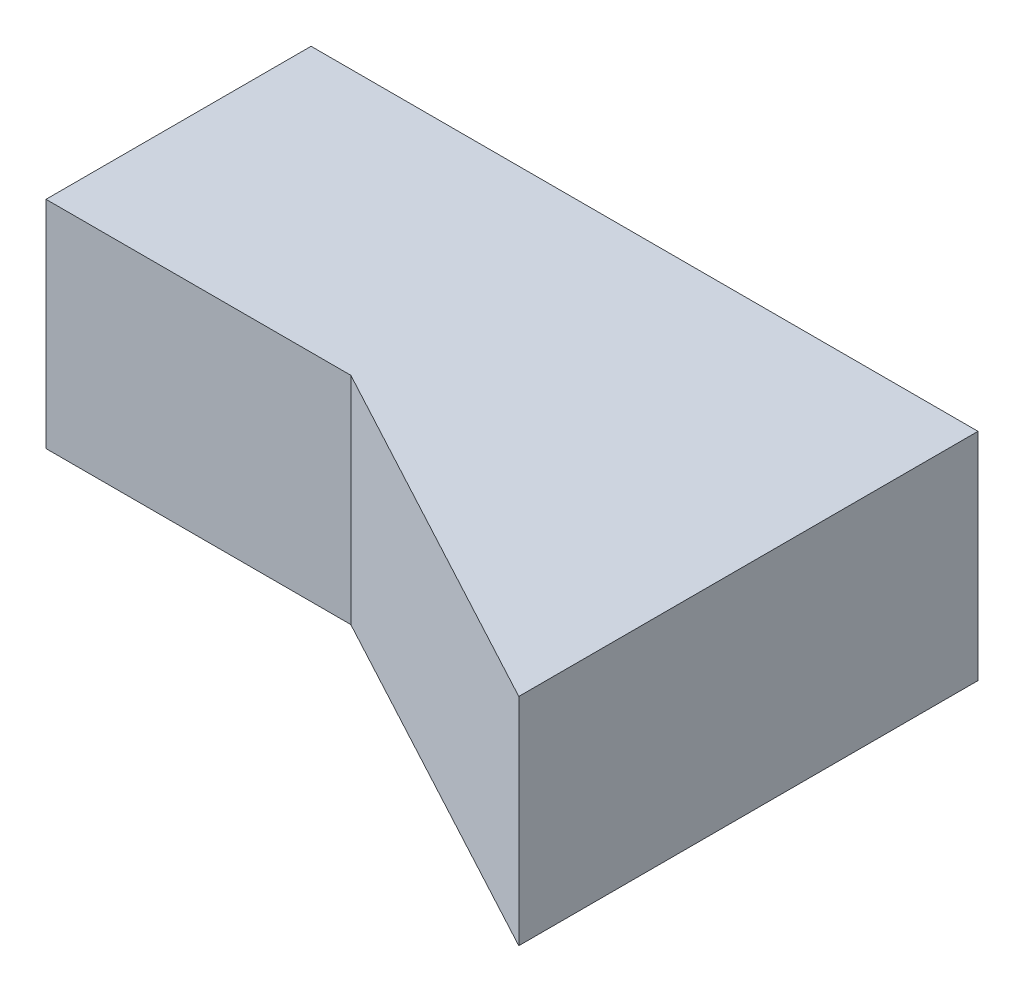
ISO-10303-21;
HEADER;
FILE_DESCRIPTION(('STEP AP214'),'2;1');
FILE_NAME('part.step','',(''),(''),'','','');
FILE_SCHEMA(('AUTOMOTIVE_DESIGN { 1 0 10303 214 1 1 1 1 }'));
ENDSEC;
DATA;
#1=APPLICATION_CONTEXT('core data for automotive mechanical design processes');
#2=APPLICATION_PROTOCOL_DEFINITION('international standard','automotive_design',2000,#1);
#3=PRODUCT_CONTEXT('',#1,'mechanical');
#4=PRODUCT('Part','Part','',(#3));
#5=PRODUCT_RELATED_PRODUCT_CATEGORY('part','',(#4));
#6=PRODUCT_DEFINITION_FORMATION('','',#4);
#7=PRODUCT_DEFINITION_CONTEXT('part definition',#1,'design');
#8=PRODUCT_DEFINITION('design','',#6,#7);
#9=PRODUCT_DEFINITION_SHAPE('','',#8);
#10=(LENGTH_UNIT() NAMED_UNIT(*) SI_UNIT(.MILLI.,.METRE.));
#11=(NAMED_UNIT(*) PLANE_ANGLE_UNIT() SI_UNIT($,.RADIAN.));
#12=(NAMED_UNIT(*) SI_UNIT($,.STERADIAN.) SOLID_ANGLE_UNIT());
#13=UNCERTAINTY_MEASURE_WITH_UNIT(LENGTH_MEASURE(1.E-05),#10,'distance_accuracy_value','');
#14=(GEOMETRIC_REPRESENTATION_CONTEXT(3) GLOBAL_UNCERTAINTY_ASSIGNED_CONTEXT((#13)) GLOBAL_UNIT_ASSIGNED_CONTEXT((#10,
#11,#12)) REPRESENTATION_CONTEXT('',''));
#15=CARTESIAN_POINT('',(0.,0.,0.));
#16=DIRECTION('',(0.,0.,1.));
#17=DIRECTION('',(1.,0.,0.));
#18=AXIS2_PLACEMENT_3D('',#15,#16,#17);
#19=CARTESIAN_POINT('',(0.,413.766,0.));
#20=DIRECTION('',(0.472550764869048,0.,-0.881303452064995));
#21=DIRECTION('',(-0.881303452064995,0.,-0.472550764869048));
#22=AXIS2_PLACEMENT_3D('',#19,#20,#21);
#23=PLANE('',#22);
#24=DIRECTION('',(0.881303452064995,0.,0.472550764869048));
#25=VECTOR('',#24,1.);
#26=CARTESIAN_POINT('',(0.,0.,0.));
#27=LINE('',#26,#25);
#28=CARTESIAN_POINT('',(0.,0.,0.));
#29=VERTEX_POINT('',#28);
#30=CARTESIAN_POINT('',(693.938338155977,0.,372.086472257889));
#31=VERTEX_POINT('',#30);
#32=EDGE_CURVE('E118',#29,#31,#27,.T.);
#33=ORIENTED_EDGE('',*,*,#32,.T.);
#34=DIRECTION('',(0.,-1.,0.));
#35=VECTOR('',#34,1.);
#36=CARTESIAN_POINT('',(693.938338155977,413.766,372.086472257889));
#37=LINE('',#36,#35);
#38=CARTESIAN_POINT('',(693.938338155977,413.766,372.086472257889));
#39=VERTEX_POINT('',#38);
#40=EDGE_CURVE('E11',#39,#31,#37,.T.);
#41=ORIENTED_EDGE('',*,*,#40,.F.);
#42=DIRECTION('',(0.881303452064995,0.,0.472550764869048));
#43=VECTOR('',#42,1.);
#44=CARTESIAN_POINT('',(0.,413.766,0.));
#45=LINE('',#44,#43);
#46=CARTESIAN_POINT('',(0.,413.766,0.));
#47=VERTEX_POINT('',#46);
#48=EDGE_CURVE('E130',#47,#39,#45,.T.);
#49=ORIENTED_EDGE('',*,*,#48,.F.);
#50=DIRECTION('',(0.,-1.,0.));
#51=VECTOR('',#50,1.);
#52=CARTESIAN_POINT('',(0.,413.766,0.));
#53=LINE('',#52,#51);
#54=EDGE_CURVE('E114',#47,#29,#53,.T.);
#55=ORIENTED_EDGE('',*,*,#54,.T.);
#56=EDGE_LOOP('',(#33,#41,#49,#55));
#57=FACE_BOUND('',#56,.T.);
#58=ADVANCED_FACE('F38',(#57),#23,.F.);
#59=CARTESIAN_POINT('',(693.938338155977,413.766,372.086472257889));
#60=DIRECTION('',(-1.,0.,0.));
#61=DIRECTION('',(0.,0.,1.));
#62=AXIS2_PLACEMENT_3D('',#59,#60,#61);
#63=PLANE('',#62);
#64=DIRECTION('',(0.,0.,-1.));
#65=VECTOR('',#64,1.);
#66=CARTESIAN_POINT('',(693.938338155977,0.,372.086472257889));
#67=LINE('',#66,#65);
#68=CARTESIAN_POINT('',(693.938338155977,0.,-508.));
#69=VERTEX_POINT('',#68);
#70=EDGE_CURVE('E122',#31,#69,#67,.T.);
#71=ORIENTED_EDGE('',*,*,#70,.T.);
#72=DIRECTION('',(0.,-1.,0.));
#73=VECTOR('',#72,1.);
#74=CARTESIAN_POINT('',(693.938338155977,413.766,-508.));
#75=LINE('',#74,#73);
#76=CARTESIAN_POINT('',(693.938338155977,413.766,-508.));
#77=VERTEX_POINT('',#76);
#78=EDGE_CURVE('E47',#77,#69,#75,.T.);
#79=ORIENTED_EDGE('',*,*,#78,.F.);
#80=DIRECTION('',(0.,0.,-1.));
#81=VECTOR('',#80,1.);
#82=CARTESIAN_POINT('',(693.938338155977,413.766,372.086472257889));
#83=LINE('',#82,#81);
#84=EDGE_CURVE('E89',#39,#77,#83,.T.);
#85=ORIENTED_EDGE('',*,*,#84,.F.);
#86=ORIENTED_EDGE('',*,*,#40,.T.);
#87=EDGE_LOOP('',(#71,#79,#85,#86));
#88=FACE_BOUND('',#87,.T.);
#89=ADVANCED_FACE('F152',(#88),#63,.F.);
#90=CARTESIAN_POINT('',(-584.2,413.766,-508.));
#91=DIRECTION('',(0.,0.,1.));
#92=DIRECTION('',(1.,0.,0.));
#93=AXIS2_PLACEMENT_3D('',#90,#91,#92);
#94=PLANE('',#93);
#95=DIRECTION('',(-1.,0.,0.));
#96=VECTOR('',#95,1.);
#97=CARTESIAN_POINT('',(-584.2,0.,-508.));
#98=LINE('',#97,#96);
#99=CARTESIAN_POINT('',(-584.2,0.,-508.));
#100=VERTEX_POINT('',#99);
#101=EDGE_CURVE('E105',#69,#100,#98,.T.);
#102=ORIENTED_EDGE('',*,*,#101,.T.);
#103=DIRECTION('',(0.,-1.,0.));
#104=VECTOR('',#103,1.);
#105=CARTESIAN_POINT('',(-584.2,413.766,-508.));
#106=LINE('',#105,#104);
#107=CARTESIAN_POINT('',(-584.2,413.766,-508.));
#108=VERTEX_POINT('',#107);
#109=EDGE_CURVE('E102',#108,#100,#106,.T.);
#110=ORIENTED_EDGE('',*,*,#109,.F.);
#111=DIRECTION('',(-1.,0.,0.));
#112=VECTOR('',#111,1.);
#113=CARTESIAN_POINT('',(-584.2,413.766,-508.));
#114=LINE('',#113,#112);
#115=EDGE_CURVE('E93',#77,#108,#114,.T.);
#116=ORIENTED_EDGE('',*,*,#115,.F.);
#117=ORIENTED_EDGE('',*,*,#78,.T.);
#118=EDGE_LOOP('',(#102,#110,#116,#117));
#119=FACE_BOUND('',#118,.T.);
#120=ADVANCED_FACE('F103',(#119),#94,.F.);
#121=CARTESIAN_POINT('',(-584.2,413.766,0.));
#122=DIRECTION('',(1.,0.,0.));
#123=DIRECTION('',(0.,0.,-1.));
#124=AXIS2_PLACEMENT_3D('',#121,#122,#123);
#125=PLANE('',#124);
#126=DIRECTION('',(0.,0.,1.));
#127=VECTOR('',#126,1.);
#128=CARTESIAN_POINT('',(-584.2,0.,0.));
#129=LINE('',#128,#127);
#130=CARTESIAN_POINT('',(-584.2,0.,0.));
#131=VERTEX_POINT('',#130);
#132=EDGE_CURVE('E75',#100,#131,#129,.T.);
#133=ORIENTED_EDGE('',*,*,#132,.T.);
#134=DIRECTION('',(0.,-1.,0.));
#135=VECTOR('',#134,1.);
#136=CARTESIAN_POINT('',(-584.2,413.766,0.));
#137=LINE('',#136,#135);
#138=CARTESIAN_POINT('',(-584.2,413.766,0.));
#139=VERTEX_POINT('',#138);
#140=EDGE_CURVE('E107',#139,#131,#137,.T.);
#141=ORIENTED_EDGE('',*,*,#140,.F.);
#142=DIRECTION('',(0.,0.,1.));
#143=VECTOR('',#142,1.);
#144=CARTESIAN_POINT('',(-584.2,413.766,0.));
#145=LINE('',#144,#143);
#146=EDGE_CURVE('E97',#108,#139,#145,.T.);
#147=ORIENTED_EDGE('',*,*,#146,.F.);
#148=ORIENTED_EDGE('',*,*,#109,.T.);
#149=EDGE_LOOP('',(#133,#141,#147,#148));
#150=FACE_BOUND('',#149,.T.);
#151=ADVANCED_FACE('F109',(#150),#125,.F.);
#152=CARTESIAN_POINT('',(0.,413.766,0.));
#153=DIRECTION('',(0.,0.,-1.));
#154=DIRECTION('',(-1.,0.,0.));
#155=AXIS2_PLACEMENT_3D('',#152,#153,#154);
#156=PLANE('',#155);
#157=DIRECTION('',(1.,0.,0.));
#158=VECTOR('',#157,1.);
#159=CARTESIAN_POINT('',(0.,0.,0.));
#160=LINE('',#159,#158);
#161=EDGE_CURVE('E81',#131,#29,#160,.T.);
#162=ORIENTED_EDGE('',*,*,#161,.T.);
#163=ORIENTED_EDGE('',*,*,#54,.F.);
#164=DIRECTION('',(1.,0.,0.));
#165=VECTOR('',#164,1.);
#166=CARTESIAN_POINT('',(0.,413.766,0.));
#167=LINE('',#166,#165);
#168=EDGE_CURVE('E55',#139,#47,#167,.T.);
#169=ORIENTED_EDGE('',*,*,#168,.F.);
#170=ORIENTED_EDGE('',*,*,#140,.T.);
#171=EDGE_LOOP('',(#162,#163,#169,#170));
#172=FACE_BOUND('',#171,.T.);
#173=ADVANCED_FACE('F141',(#172),#156,.F.);
#174=CARTESIAN_POINT('',(0.,413.766,0.));
#175=DIRECTION('',(0.,1.,0.));
#176=DIRECTION('',(0.,0.,1.));
#177=AXIS2_PLACEMENT_3D('',#174,#175,#176);
#178=PLANE('',#177);
#179=ORIENTED_EDGE('',*,*,#48,.T.);
#180=ORIENTED_EDGE('',*,*,#84,.T.);
#181=ORIENTED_EDGE('',*,*,#115,.T.);
#182=ORIENTED_EDGE('',*,*,#146,.T.);
#183=ORIENTED_EDGE('',*,*,#168,.T.);
#184=EDGE_LOOP('',(#179,#180,#181,#182,#183));
#185=FACE_BOUND('',#184,.T.);
#186=ADVANCED_FACE('F95',(#185),#178,.T.);
#187=CARTESIAN_POINT('',(0.,0.,0.));
#188=DIRECTION('',(0.,1.,0.));
#189=DIRECTION('',(0.,0.,1.));
#190=AXIS2_PLACEMENT_3D('',#187,#188,#189);
#191=PLANE('',#190);
#192=ORIENTED_EDGE('',*,*,#32,.F.);
#193=ORIENTED_EDGE('',*,*,#161,.F.);
#194=ORIENTED_EDGE('',*,*,#132,.F.);
#195=ORIENTED_EDGE('',*,*,#101,.F.);
#196=ORIENTED_EDGE('',*,*,#70,.F.);
#197=EDGE_LOOP('',(#192,#193,#194,#195,#196));
#198=FACE_BOUND('',#197,.T.);
#199=ADVANCED_FACE('F137',(#198),#191,.F.);
#200=CLOSED_SHELL('',(#58,#89,#120,#151,#173,#186,#199));
#201=MANIFOLD_SOLID_BREP('B2',#200);
#202=ADVANCED_BREP_SHAPE_REPRESENTATION('',(#18,#201),#14);
#203=SHAPE_DEFINITION_REPRESENTATION(#9,#202);
ENDSEC;
END-ISO-10303-21;
